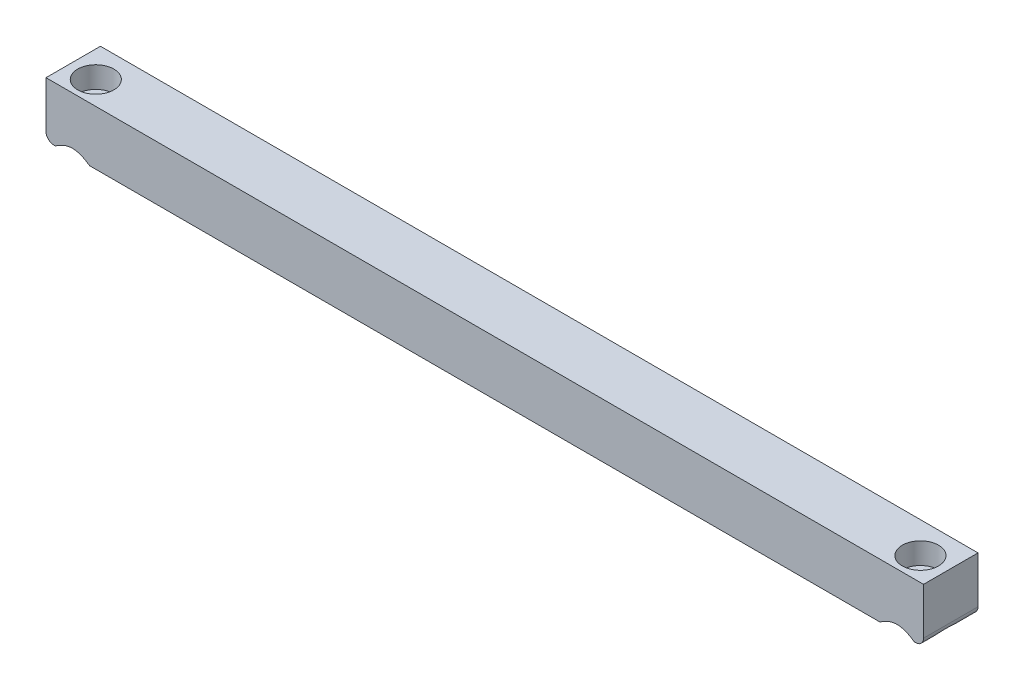
ISO-10303-21;
HEADER;
FILE_DESCRIPTION(('STEP AP214'),'2;1');
FILE_NAME('part.step','',(''),(''),'','','');
FILE_SCHEMA(('AUTOMOTIVE_DESIGN { 1 0 10303 214 1 1 1 1 }'));
ENDSEC;
DATA;
#1=APPLICATION_CONTEXT('core data for automotive mechanical design processes');
#2=APPLICATION_PROTOCOL_DEFINITION('international standard','automotive_design',2000,#1);
#3=PRODUCT_CONTEXT('',#1,'mechanical');
#4=PRODUCT('Part','Part','',(#3));
#5=PRODUCT_RELATED_PRODUCT_CATEGORY('part','',(#4));
#6=PRODUCT_DEFINITION_FORMATION('','',#4);
#7=PRODUCT_DEFINITION_CONTEXT('part definition',#1,'design');
#8=PRODUCT_DEFINITION('design','',#6,#7);
#9=PRODUCT_DEFINITION_SHAPE('','',#8);
#10=(LENGTH_UNIT() NAMED_UNIT(*) SI_UNIT(.MILLI.,.METRE.));
#11=(NAMED_UNIT(*) PLANE_ANGLE_UNIT() SI_UNIT($,.RADIAN.));
#12=(NAMED_UNIT(*) SI_UNIT($,.STERADIAN.) SOLID_ANGLE_UNIT());
#13=UNCERTAINTY_MEASURE_WITH_UNIT(LENGTH_MEASURE(1.E-05),#10,'distance_accuracy_value','');
#14=(GEOMETRIC_REPRESENTATION_CONTEXT(3) GLOBAL_UNCERTAINTY_ASSIGNED_CONTEXT((#13)) GLOBAL_UNIT_ASSIGNED_CONTEXT((#10,
#11,#12)) REPRESENTATION_CONTEXT('',''));
#15=CARTESIAN_POINT('',(0.,0.,0.));
#16=DIRECTION('',(0.,0.,1.));
#17=DIRECTION('',(1.,0.,0.));
#18=AXIS2_PLACEMENT_3D('',#15,#16,#17);
#19=CARTESIAN_POINT('',(109.4,0.,-3.));
#20=DIRECTION('',(0.,-1.,0.));
#21=DIRECTION('',(0.,0.,-1.));
#22=AXIS2_PLACEMENT_3D('',#19,#20,#21);
#23=CYLINDRICAL_SURFACE('',#22,1.47319999999999);
#24=CARTESIAN_POINT('',(109.4,2.59245827868183,-3.));
#25=DIRECTION('',(0.,-1.,0.));
#26=DIRECTION('',(0.,0.,-1.));
#27=AXIS2_PLACEMENT_3D('',#24,#25,#26);
#28=CIRCLE('',#27,1.47319999999999);
#29=CARTESIAN_POINT('',(109.4,2.59245827868183,-4.47319999999999));
#30=VERTEX_POINT('',#29);
#31=EDGE_CURVE('E156',#30,#30,#28,.T.);
#32=ORIENTED_EDGE('',*,*,#31,.T.);
#33=EDGE_LOOP('',(#32));
#34=FACE_BOUND('',#33,.T.);
#35=CARTESIAN_POINT('',(109.4,4.25,-3.));
#36=DIRECTION('',(0.,1.,0.));
#37=DIRECTION('',(0.,0.,1.));
#38=AXIS2_PLACEMENT_3D('',#35,#36,#37);
#39=CIRCLE('',#38,1.47319999999999);
#40=CARTESIAN_POINT('',(109.4,4.25,-1.52680000000001));
#41=VERTEX_POINT('',#40);
#42=EDGE_CURVE('E43',#41,#41,#39,.F.);
#43=ORIENTED_EDGE('',*,*,#42,.F.);
#44=EDGE_LOOP('',(#43));
#45=FACE_BOUND('',#44,.T.);
#46=ADVANCED_FACE('F38',(#34,#45),#23,.F.);
#47=CARTESIAN_POINT('',(3.4,0.,-3.));
#48=DIRECTION('',(0.,-1.,0.));
#49=DIRECTION('',(0.,0.,-1.));
#50=AXIS2_PLACEMENT_3D('',#47,#48,#49);
#51=CYLINDRICAL_SURFACE('',#50,1.4732);
#52=CARTESIAN_POINT('',(3.4,2.59245827868183,-3.));
#53=DIRECTION('',(0.,-1.,0.));
#54=DIRECTION('',(0.,0.,-1.));
#55=AXIS2_PLACEMENT_3D('',#52,#53,#54);
#56=CIRCLE('',#55,1.4732);
#57=CARTESIAN_POINT('',(3.4,2.59245827868183,-4.4732));
#58=VERTEX_POINT('',#57);
#59=EDGE_CURVE('E144',#58,#58,#56,.T.);
#60=ORIENTED_EDGE('',*,*,#59,.T.);
#61=EDGE_LOOP('',(#60));
#62=FACE_BOUND('',#61,.T.);
#63=CARTESIAN_POINT('',(3.4,4.25,-3.));
#64=DIRECTION('',(0.,1.,0.));
#65=DIRECTION('',(0.,0.,1.));
#66=AXIS2_PLACEMENT_3D('',#63,#64,#65);
#67=CIRCLE('',#66,1.4732);
#68=CARTESIAN_POINT('',(3.4,4.25,-1.5268));
#69=VERTEX_POINT('',#68);
#70=EDGE_CURVE('E149',#69,#69,#67,.F.);
#71=ORIENTED_EDGE('',*,*,#70,.F.);
#72=EDGE_LOOP('',(#71));
#73=FACE_BOUND('',#72,.T.);
#74=ADVANCED_FACE('F180',(#62,#73),#51,.F.);
#75=CARTESIAN_POINT('',(0.,0.,0.));
#76=DIRECTION('',(0.,-1.,0.));
#77=DIRECTION('',(0.,0.,-1.));
#78=AXIS2_PLACEMENT_3D('',#75,#76,#77);
#79=PLANE('',#78);
#80=DIRECTION('',(1.,0.,0.));
#81=VECTOR('',#80,1.);
#82=CARTESIAN_POINT('',(0.,0.,0.));
#83=LINE('',#82,#81);
#84=CARTESIAN_POINT('',(1.,0.,0.));
#85=VERTEX_POINT('',#84);
#86=CARTESIAN_POINT('',(1.18890056246487,0.,0.));
#87=VERTEX_POINT('',#86);
#88=EDGE_CURVE('E118',#85,#87,#83,.T.);
#89=ORIENTED_EDGE('',*,*,#88,.F.);
#90=DIRECTION('',(0.,0.,-1.));
#91=VECTOR('',#90,1.);
#92=CARTESIAN_POINT('',(1.,0.,-0.0744333825923676));
#93=LINE('',#92,#91);
#94=CARTESIAN_POINT('',(1.,0.,-0.148866765184735));
#95=VERTEX_POINT('',#94);
#96=EDGE_CURVE('E143',#85,#95,#93,.T.);
#97=ORIENTED_EDGE('',*,*,#96,.T.);
#98=CARTESIAN_POINT('',(3.4,0.,-3.));
#99=DIRECTION('',(0.,-1.,0.));
#100=DIRECTION('',(0.,0.,-1.));
#101=AXIS2_PLACEMENT_3D('',#98,#99,#100);
#102=CIRCLE('',#101,3.7267896);
#103=EDGE_CURVE('E135',#87,#95,#102,.T.);
#104=ORIENTED_EDGE('',*,*,#103,.F.);
#105=EDGE_LOOP('',(#89,#97,#104));
#106=FACE_BOUND('',#105,.T.);
#107=ADVANCED_FACE('F142',(#106),#79,.T.);
#108=CARTESIAN_POINT('',(109.4,0.,-3.));
#109=DIRECTION('',(0.,-1.,0.));
#110=DIRECTION('',(0.,0.,-1.));
#111=AXIS2_PLACEMENT_3D('',#108,#109,#110);
#112=CIRCLE('',#111,3.7267896);
#113=CARTESIAN_POINT('',(111.8,0.,-0.148866765184731));
#114=VERTEX_POINT('',#113);
#115=CARTESIAN_POINT('',(111.611099437535,0.,0.));
#116=VERTEX_POINT('',#115);
#117=EDGE_CURVE('E155',#114,#116,#112,.T.);
#118=ORIENTED_EDGE('',*,*,#117,.F.);
#119=DIRECTION('',(0.,0.,-1.));
#120=VECTOR('',#119,1.);
#121=CARTESIAN_POINT('',(111.8,0.,0.));
#122=LINE('',#121,#120);
#123=CARTESIAN_POINT('',(111.8,0.,0.));
#124=VERTEX_POINT('',#123);
#125=EDGE_CURVE('E11',#114,#124,#122,.F.);
#126=ORIENTED_EDGE('',*,*,#125,.T.);
#127=EDGE_CURVE('E131',#116,#124,#83,.T.);
#128=ORIENTED_EDGE('',*,*,#127,.F.);
#129=EDGE_LOOP('',(#118,#126,#128));
#130=FACE_BOUND('',#129,.T.);
#131=ADVANCED_FACE('F230',(#130),#79,.T.);
#132=CARTESIAN_POINT('',(0.,7.,0.));
#133=DIRECTION('',(1.,0.,0.));
#134=DIRECTION('',(0.,0.,-1.));
#135=AXIS2_PLACEMENT_3D('',#132,#133,#134);
#136=PLANE('',#135);
#137=DIRECTION('',(0.,-1.,0.));
#138=VECTOR('',#137,1.);
#139=CARTESIAN_POINT('',(0.,7.,-7.));
#140=LINE('',#139,#138);
#141=CARTESIAN_POINT('',(0.,7.,-7.));
#142=VERTEX_POINT('',#141);
#143=CARTESIAN_POINT('',(0.,1.,-7.));
#144=VERTEX_POINT('',#143);
#145=EDGE_CURVE('E239',#142,#144,#140,.T.);
#146=ORIENTED_EDGE('',*,*,#145,.T.);
#147=DIRECTION('',(0.,0.,1.));
#148=VECTOR('',#147,1.);
#149=CARTESIAN_POINT('',(0.,1.,-4.52609328766893));
#150=LINE('',#149,#148);
#151=CARTESIAN_POINT('',(0.,1.,0.));
#152=VERTEX_POINT('',#151);
#153=EDGE_CURVE('E139',#144,#152,#150,.T.);
#154=ORIENTED_EDGE('',*,*,#153,.T.);
#155=DIRECTION('',(0.,-1.,0.));
#156=VECTOR('',#155,1.);
#157=CARTESIAN_POINT('',(0.,7.,0.));
#158=LINE('',#157,#156);
#159=CARTESIAN_POINT('',(0.,7.,0.));
#160=VERTEX_POINT('',#159);
#161=EDGE_CURVE('E140',#160,#152,#158,.T.);
#162=ORIENTED_EDGE('',*,*,#161,.F.);
#163=DIRECTION('',(0.,0.,1.));
#164=VECTOR('',#163,1.);
#165=CARTESIAN_POINT('',(0.,7.,0.));
#166=LINE('',#165,#164);
#167=EDGE_CURVE('E168',#142,#160,#166,.T.);
#168=ORIENTED_EDGE('',*,*,#167,.F.);
#169=EDGE_LOOP('',(#146,#154,#162,#168));
#170=FACE_BOUND('',#169,.T.);
#171=ADVANCED_FACE('F274',(#170),#136,.F.);
#172=CARTESIAN_POINT('',(0.,7.,0.));
#173=DIRECTION('',(0.,0.,-1.));
#174=DIRECTION('',(-1.,0.,0.));
#175=AXIS2_PLACEMENT_3D('',#172,#173,#174);
#176=PLANE('',#175);
#177=ORIENTED_EDGE('',*,*,#161,.T.);
#178=CARTESIAN_POINT('',(1.,1.,0.));
#179=DIRECTION('',(0.,0.,-1.));
#180=DIRECTION('',(-1.,0.,0.));
#181=AXIS2_PLACEMENT_3D('',#178,#179,#180);
#182=CIRCLE('',#181,1.);
#183=EDGE_CURVE('E124',#152,#85,#182,.F.);
#184=ORIENTED_EDGE('',*,*,#183,.T.);
#185=ORIENTED_EDGE('',*,*,#88,.T.);
#186=CARTESIAN_POINT('',(-2.04068777861092,-2.86003146733069,0.));
#187=CARTESIAN_POINT('',(-1.91486649897334,-2.73330479596745,0.));
#188=CARTESIAN_POINT('',(-1.78855170996633,-2.60706286419875,0.));
#189=CARTESIAN_POINT('',(-1.53467062600414,-2.35580779330241,0.));
#190=CARTESIAN_POINT('',(-1.4071041529885,-2.23079483422062,0.));
#191=CARTESIAN_POINT('',(-1.14970407350928,-1.98153133379802,0.));
#192=CARTESIAN_POINT('',(-1.01986135862312,-1.85729017821418,0.));
#193=CARTESIAN_POINT('',(-0.758343842968389,-1.61076584767834,0.));
#194=CARTESIAN_POINT('',(-0.626669171395467,-1.48848253594776,0.));
#195=CARTESIAN_POINT('',(-0.351011636578417,-1.23727995201919,0.));
#196=CARTESIAN_POINT('',(-0.206849846252394,-1.10855633982085,0.));
#197=CARTESIAN_POINT('',(0.0848457089383862,-0.854992556540578,0.));
#198=CARTESIAN_POINT('',(0.232379167524994,-0.730152035136792,0.));
#199=CARTESIAN_POINT('',(0.531467467014695,-0.486138070093254,0.));
#200=CARTESIAN_POINT('',(0.683011278943903,-0.366951182427039,0.));
#201=CARTESIAN_POINT('',(0.991783172682102,-0.136233023724518,0.));
#202=CARTESIAN_POINT('',(1.1490080808976,-0.024697576348754,0.));
#203=CARTESIAN_POINT('',(1.41083744013197,0.147458470532663,0.));
#204=CARTESIAN_POINT('',(1.51315958217322,0.21153490963247,0.));
#205=CARTESIAN_POINT('',(1.72131542570844,0.333868056938868,0.));
#206=CARTESIAN_POINT('',(1.8271504064441,0.392122613364814,0.));
#207=CARTESIAN_POINT('',(2.04165059954081,0.500402836140528,0.));
#208=CARTESIAN_POINT('',(2.1502763376689,0.550505803200049,0.));
#209=CARTESIAN_POINT('',(2.37156069039562,0.640854303914732,0.));
#210=CARTESIAN_POINT('',(2.48421631226366,0.681106985422038,0.));
#211=CARTESIAN_POINT('',(2.67395497495853,0.737430746788554,0.));
#212=CARTESIAN_POINT('',(2.74998257329001,0.757060179930614,0.));
#213=CARTESIAN_POINT('',(2.90337132102818,0.790179918590291,0.));
#214=CARTESIAN_POINT('',(2.98073224887029,0.803671234086619,0.));
#215=CARTESIAN_POINT('',(3.13619236615175,0.823894969971055,0.));
#216=CARTESIAN_POINT('',(3.21428985612826,0.830640297079974,0.));
#217=CARTESIAN_POINT('',(3.3707801545543,0.837084282223051,0.));
#218=CARTESIAN_POINT('',(3.44917296526486,0.836782886196276,0.));
#219=CARTESIAN_POINT('',(3.60557290513233,0.829150363546847,0.));
#220=CARTESIAN_POINT('',(3.6835802012989,0.82182261000086,0.));
#221=CARTESIAN_POINT('',(3.83866862667551,0.80050199168716,0.));
#222=CARTESIAN_POINT('',(3.91574972159787,0.786508880944609,0.));
#223=CARTESIAN_POINT('',(4.06874873034158,0.752427518223542,0.));
#224=CARTESIAN_POINT('',(4.14466307756359,0.732323431663419,0.));
#225=CARTESIAN_POINT('',(4.29486234473077,0.68678006453453,0.));
#226=CARTESIAN_POINT('',(4.36914706336642,0.66134012887722,0.));
#227=CARTESIAN_POINT('',(4.57553058918519,0.583408687015946,0.));
#228=CARTESIAN_POINT('',(4.70566565579019,0.525709001786743,0.));
#229=CARTESIAN_POINT('',(4.96050096361983,0.399359549474757,0.));
#230=CARTESIAN_POINT('',(5.08519584379824,0.330699278340149,0.));
#231=CARTESIAN_POINT('',(5.33109179280967,0.184715416139402,0.));
#232=CARTESIAN_POINT('',(5.45224401426801,0.107310317579822,0.));
#233=CARTESIAN_POINT('',(5.63091168883304,-0.0132053481505687,0.));
#234=CARTESIAN_POINT('',(5.68994526821586,-0.054102760598346,0.));
#235=CARTESIAN_POINT('',(5.80710062280101,-0.137179431681928,0.));
#236=CARTESIAN_POINT('',(5.86522244055787,-0.179358630221579,0.));
#237=CARTESIAN_POINT('',(6.06936720042129,-0.330501041733518,0.));
#238=CARTESIAN_POINT('',(6.21317505454578,-0.442458800308884,0.));
#239=CARTESIAN_POINT('',(6.49675622291531,-0.671390916948923,0.));
#240=CARTESIAN_POINT('',(6.63652847003451,-0.788366581924544,0.));
#241=CARTESIAN_POINT('',(6.91301659959453,-1.02608272641852,0.));
#242=CARTESIAN_POINT('',(7.04972996450185,-1.14682612436052,0.));
#243=CARTESIAN_POINT('',(7.32066184490263,-1.39108676164083,0.));
#244=CARTESIAN_POINT('',(7.45488019829149,-1.51460418006808,0.));
#245=CARTESIAN_POINT('',(7.72180187615818,-1.76422814328495,0.));
#246=CARTESIAN_POINT('',(7.85449789001344,-1.89034248784701,0.));
#247=CARTESIAN_POINT('',(8.1182571565112,-2.14426918204297,0.));
#248=CARTESIAN_POINT('',(8.24932037387865,-2.27208156823864,0.));
#249=CARTESIAN_POINT('',(8.6403868657633,-2.65740964488783,0.));
#250=CARTESIAN_POINT('',(8.89840112330797,-2.91694307558273,0.));
#251=CARTESIAN_POINT('',(9.38253517149522,-3.4108152449966,0.));
#252=CARTESIAN_POINT('',(9.60903795528634,-3.64478065203675,0.));
#253=CARTESIAN_POINT('',(10.0598871104133,-4.11484237766952,0.));
#254=CARTESIAN_POINT('',(10.2842331718655,-4.35093899330259,0.));
#255=CARTESIAN_POINT('',(10.7296264543588,-4.82297873862795,0.));
#256=CARTESIAN_POINT('',(10.9506858012058,-5.05891044832355,0.));
#257=CARTESIAN_POINT('',(11.3914553985292,-5.5319533250451,0.));
#258=CARTESIAN_POINT('',(11.6111658807878,-5.76906427599745,0.));
#259=CARTESIAN_POINT('',(11.8303892830653,-6.00662142901221,0.));
#260=B_SPLINE_CURVE_WITH_KNOTS('',3,(#186,#187,#188,#189,#190,#191,#192,#193,#194,#195,#196,
#197,#198,#199,#200,#201,#202,#203,#204,#205,#206,#207,#208,#209,#210,#211,#212,#213,#214,#215,
#216,#217,#218,#219,#220,#221,#222,#223,#224,#225,#226,#227,#228,#229,#230,#231,#232,#233,#234,
#235,#236,#237,#238,#239,#240,#241,#242,#243,#244,#245,#246,#247,#248,#249,#250,#251,#252,#253,
#254,#255,#256,#257,#258,#259),.UNSPECIFIED.,.F.,.F.,(4,2,2,2,2,2,2,2,2,2,2,2,2,2,2,2,2,2,2,2,2,
2,2,2,2,2,2,2,2,2,2,2,2,2,2,2,4),(0.,0.535742754814112,1.07156286066978,1.61067093643198,
2.14974118331161,2.72949434677193,3.30919505387695,3.88744000267539,4.46536677809085,
4.82741275383952,5.18959205150453,5.54810658541805,5.9063601869102,6.14170689815212,
6.37701487093671,6.61187177595003,6.84673048273524,7.08147649955084,7.31623117998124,
7.55159941158319,7.786996556555,8.21327203870869,8.63995852094344,9.0710139581208,
9.28645026439798,9.50187648554516,10.0484458807097,10.5951585042974,11.1423056617079,
11.6894882447035,12.2386664302878,12.7878564598511,13.8856828340155,14.8625972954027,
15.8396500852786,16.8095826066398,17.7793435128104),.UNSPECIFIED.);
#261=CARTESIAN_POINT('',(5.61109943753513,0.,0.));
#262=VERTEX_POINT('',#261);
#263=EDGE_CURVE('E122',#87,#262,#260,.T.);
#264=ORIENTED_EDGE('',*,*,#263,.T.);
#265=CARTESIAN_POINT('',(107.188900562465,0.,0.));
#266=VERTEX_POINT('',#265);
#267=EDGE_CURVE('E129',#262,#266,#83,.T.);
#268=ORIENTED_EDGE('',*,*,#267,.T.);
#269=CARTESIAN_POINT('',(103.705130389263,-3.11743400278562,0.));
#270=CARTESIAN_POINT('',(103.834866190214,-2.98541242586914,0.));
#271=CARTESIAN_POINT('',(103.965073740249,-2.85384989499515,0.));
#272=CARTESIAN_POINT('',(104.22668312501,-2.59188727869565,0.));
#273=CARTESIAN_POINT('',(104.358085099307,-2.46148733274044,0.));
#274=CARTESIAN_POINT('',(104.622951443361,-2.20148960109288,0.));
#275=CARTESIAN_POINT('',(104.756422767396,-2.07189888629847,0.));
#276=CARTESIAN_POINT('',(105.025113451699,-1.81455435818634,0.));
#277=CARTESIAN_POINT('',(105.160332712809,-1.68680044152998,0.));
#278=CARTESIAN_POINT('',(105.441352187948,-1.42583009575077,0.));
#279=CARTESIAN_POINT('',(105.587290871372,-1.29276231710516,0.));
#280=CARTESIAN_POINT('',(105.882297679323,-1.03014574241715,0.));
#281=CARTESIAN_POINT('',(106.031365579675,-0.900596695809904,0.));
#282=CARTESIAN_POINT('',(106.333275270313,-0.646573728375905,0.));
#283=CARTESIAN_POINT('',(106.486108920771,-0.522090179898503,0.));
#284=CARTESIAN_POINT('',(106.79706806431,-0.279956176065771,0.));
#285=CARTESIAN_POINT('',(106.955191287666,-0.162302847710047,0.));
#286=CARTESIAN_POINT('',(107.220100546624,0.0222374398860309,0.));
#287=CARTESIAN_POINT('',(107.32479804914,0.0921104792451901,0.));
#288=CARTESIAN_POINT('',(107.537677643142,0.226476758667606,0.));
#289=CARTESIAN_POINT('',(107.645860970438,0.29096806102704,0.));
#290=CARTESIAN_POINT('',(107.865370700341,0.41231839492837,0.));
#291=CARTESIAN_POINT('',(107.9766661683,0.469232810411342,0.));
#292=CARTESIAN_POINT('',(108.203584468344,0.573678005608308,0.));
#293=CARTESIAN_POINT('',(108.319204245506,0.621215266266091,0.));
#294=CARTESIAN_POINT('',(108.512239678989,0.689085407664876,0.));
#295=CARTESIAN_POINT('',(108.588379933849,0.713044059886367,0.));
#296=CARTESIAN_POINT('',(108.742241575575,0.755143685885798,0.));
#297=CARTESIAN_POINT('',(108.819962311916,0.773287003702679,0.));
#298=CARTESIAN_POINT('',(108.976458399085,0.80297909947518,0.));
#299=CARTESIAN_POINT('',(109.055230469604,0.814544958133524,0.));
#300=CARTESIAN_POINT('',(109.213500316116,0.830602123889998,0.));
#301=CARTESIAN_POINT('',(109.292998067736,0.835093667725252,0.));
#302=CARTESIAN_POINT('',(109.45236562589,0.836771768911366,0.));
#303=CARTESIAN_POINT('',(109.532235722595,0.833931300730975,0.));
#304=CARTESIAN_POINT('',(109.691384301318,0.821038496703048,0.));
#305=CARTESIAN_POINT('',(109.770662770548,0.81098600541666,0.));
#306=CARTESIAN_POINT('',(109.928259471307,0.784131463980641,0.));
#307=CARTESIAN_POINT('',(110.006574779693,0.7673124692997,0.));
#308=CARTESIAN_POINT('',(110.161655235453,0.727650852604915,0.));
#309=CARTESIAN_POINT('',(110.238420120998,0.704807222181138,0.));
#310=CARTESIAN_POINT('',(110.436360484341,0.638425635537919,0.));
#311=CARTESIAN_POINT('',(110.55614950107,0.590751573459242,0.));
#312=CARTESIAN_POINT('',(110.791101713906,0.48514167503836,0.));
#313=CARTESIAN_POINT('',(110.906261199286,0.42719780064689,0.));
#314=CARTESIAN_POINT('',(111.13356396879,0.302995648029132,0.));
#315=CARTESIAN_POINT('',(111.245661895886,0.236655170034211,0.));
#316=CARTESIAN_POINT('',(111.410991110974,0.132779650740924,0.));
#317=CARTESIAN_POINT('',(111.465621866769,0.0974336172605208,0.));
#318=CARTESIAN_POINT('',(111.5740329594,0.025464214085633,0.));
#319=CARTESIAN_POINT('',(111.627813335162,-0.0111590968909532,0.));
#320=CARTESIAN_POINT('',(111.809585940385,-0.13772143053316,0.));
#321=CARTESIAN_POINT('',(111.935736550628,-0.230308860851537,0.));
#322=CARTESIAN_POINT('',(112.184482896106,-0.420160187777676,0.));
#323=CARTESIAN_POINT('',(112.307077653253,-0.517425351869592,0.));
#324=CARTESIAN_POINT('',(112.549499103698,-0.715541632934457,0.));
#325=CARTESIAN_POINT('',(112.6693233431,-0.81639574201673,0.));
#326=CARTESIAN_POINT('',(112.90665558883,-1.02080022245507,0.));
#327=CARTESIAN_POINT('',(113.024163421958,-1.12435079409602,0.));
#328=CARTESIAN_POINT('',(113.257761317871,-1.33398579258016,0.));
#329=CARTESIAN_POINT('',(113.373843616167,-1.44007885077537,0.));
#330=CARTESIAN_POINT('',(113.604436193134,-1.65396201783054,0.));
#331=CARTESIAN_POINT('',(113.718946429351,-1.76175217235218,0.));
#332=CARTESIAN_POINT('',(114.060408328761,-2.08704733517986,0.));
#333=CARTESIAN_POINT('',(114.285416954751,-2.3065912519256,0.));
#334=CARTESIAN_POINT('',(114.707373810576,-2.72517756543968,0.));
#335=CARTESIAN_POINT('',(114.904702012572,-2.92383934501029,0.));
#336=CARTESIAN_POINT('',(115.297165057688,-3.32337360484979,0.));
#337=CARTESIAN_POINT('',(115.492299573712,-3.52424640618925,0.));
#338=CARTESIAN_POINT('',(115.879216109001,-3.92594528196816,0.));
#339=CARTESIAN_POINT('',(116.071012521676,-4.12675752241048,0.));
#340=CARTESIAN_POINT('',(116.453211677786,-4.52963014583751,0.));
#341=CARTESIAN_POINT('',(116.643614686039,-4.7316902774499,0.));
#342=CARTESIAN_POINT('',(116.833505864438,-4.93422619840699,0.));
#343=B_SPLINE_CURVE_WITH_KNOTS('',3,(#269,#270,#271,#272,#273,#274,#275,#276,#277,#278,#279,
#280,#281,#282,#283,#284,#285,#286,#287,#288,#289,#290,#291,#292,#293,#294,#295,#296,#297,#298,
#299,#300,#301,#302,#303,#304,#305,#306,#307,#308,#309,#310,#311,#312,#313,#314,#315,#316,#317,
#318,#319,#320,#321,#322,#323,#324,#325,#326,#327,#328,#329,#330,#331,#332,#333,#334,#335,#336,
#337,#338,#339,#340,#341,#342),.UNSPECIFIED.,.F.,.F.,(4,2,2,2,2,2,2,2,2,2,2,2,2,2,2,2,2,2,2,2,2,
2,2,2,2,2,2,2,2,2,2,2,2,2,2,2,4),(0.,0.555296075733846,1.11065789500548,1.66874349884863,
2.22679758084293,2.81924795009357,3.41165602044101,4.002879847253,4.59385315791205,
4.97134896797717,5.34898011484625,5.72367850731621,6.09811701564738,6.33738815104747,
6.5765627196455,6.81511331683816,7.05365593092802,7.29307905897769,7.53250734740654,
7.77253897654797,8.01261080796531,8.39869970218151,8.78509212850169,9.175611834905,
9.3708029728038,9.56598514934137,10.0352598242157,10.5046623786996,10.9744658911685,
11.4443043992864,11.9160645715651,12.387837458678,13.33087371724,14.1708822993262,
15.011014515058,15.8440762738517,16.6769753666541),.UNSPECIFIED.);
#344=EDGE_CURVE('E159',#266,#116,#343,.T.);
#345=ORIENTED_EDGE('',*,*,#344,.T.);
#346=ORIENTED_EDGE('',*,*,#127,.T.);
#347=CARTESIAN_POINT('',(111.8,1.,0.));
#348=DIRECTION('',(0.,0.,-1.));
#349=DIRECTION('',(-1.,0.,0.));
#350=AXIS2_PLACEMENT_3D('',#347,#348,#349);
#351=CIRCLE('',#350,1.);
#352=CARTESIAN_POINT('',(112.8,1.,0.));
#353=VERTEX_POINT('',#352);
#354=EDGE_CURVE('E226',#124,#353,#351,.F.);
#355=ORIENTED_EDGE('',*,*,#354,.T.);
#356=DIRECTION('',(0.,-1.,0.));
#357=VECTOR('',#356,1.);
#358=CARTESIAN_POINT('',(112.8,7.,0.));
#359=LINE('',#358,#357);
#360=CARTESIAN_POINT('',(112.8,7.,0.));
#361=VERTEX_POINT('',#360);
#362=EDGE_CURVE('E245',#361,#353,#359,.T.);
#363=ORIENTED_EDGE('',*,*,#362,.F.);
#364=DIRECTION('',(1.,0.,0.));
#365=VECTOR('',#364,1.);
#366=CARTESIAN_POINT('',(0.,7.,0.));
#367=LINE('',#366,#365);
#368=EDGE_CURVE('E302',#160,#361,#367,.T.);
#369=ORIENTED_EDGE('',*,*,#368,.F.);
#370=EDGE_LOOP('',(#177,#184,#185,#264,#268,#345,#346,#355,#363,#369));
#371=FACE_BOUND('',#370,.T.);
#372=ADVANCED_FACE('F121',(#371),#176,.F.);
#373=CARTESIAN_POINT('',(112.8,7.,0.));
#374=DIRECTION('',(-1.,0.,0.));
#375=DIRECTION('',(0.,0.,1.));
#376=AXIS2_PLACEMENT_3D('',#373,#374,#375);
#377=PLANE('',#376);
#378=ORIENTED_EDGE('',*,*,#362,.T.);
#379=DIRECTION('',(0.,0.,-1.));
#380=VECTOR('',#379,1.);
#381=CARTESIAN_POINT('',(112.8,1.,-1.47390671233107));
#382=LINE('',#381,#380);
#383=CARTESIAN_POINT('',(112.8,1.,-7.));
#384=VERTEX_POINT('',#383);
#385=EDGE_CURVE('E190',#353,#384,#382,.T.);
#386=ORIENTED_EDGE('',*,*,#385,.T.);
#387=DIRECTION('',(0.,-1.,0.));
#388=VECTOR('',#387,1.);
#389=CARTESIAN_POINT('',(112.8,7.,-7.));
#390=LINE('',#389,#388);
#391=CARTESIAN_POINT('',(112.8,7.,-7.));
#392=VERTEX_POINT('',#391);
#393=EDGE_CURVE('E242',#392,#384,#390,.T.);
#394=ORIENTED_EDGE('',*,*,#393,.F.);
#395=DIRECTION('',(0.,0.,-1.));
#396=VECTOR('',#395,1.);
#397=CARTESIAN_POINT('',(112.8,7.,0.));
#398=LINE('',#397,#396);
#399=EDGE_CURVE('E301',#361,#392,#398,.T.);
#400=ORIENTED_EDGE('',*,*,#399,.F.);
#401=EDGE_LOOP('',(#378,#386,#394,#400));
#402=FACE_BOUND('',#401,.T.);
#403=ADVANCED_FACE('F281',(#402),#377,.F.);
#404=CARTESIAN_POINT('',(0.,7.,-7.));
#405=DIRECTION('',(0.,0.,1.));
#406=DIRECTION('',(1.,0.,0.));
#407=AXIS2_PLACEMENT_3D('',#404,#405,#406);
#408=PLANE('',#407);
#409=DIRECTION('',(-1.,0.,0.));
#410=VECTOR('',#409,1.);
#411=CARTESIAN_POINT('',(0.,0.,-7.));
#412=LINE('',#411,#410);
#413=CARTESIAN_POINT('',(111.8,0.,-7.));
#414=VERTEX_POINT('',#413);
#415=CARTESIAN_POINT('',(1.,0.,-7.));
#416=VERTEX_POINT('',#415);
#417=EDGE_CURVE('E128',#414,#416,#412,.T.);
#418=ORIENTED_EDGE('',*,*,#417,.T.);
#419=CARTESIAN_POINT('',(1.,1.,-7.));
#420=DIRECTION('',(0.,0.,1.));
#421=DIRECTION('',(1.,0.,0.));
#422=AXIS2_PLACEMENT_3D('',#419,#420,#421);
#423=CIRCLE('',#422,1.);
#424=EDGE_CURVE('E293',#416,#144,#423,.F.);
#425=ORIENTED_EDGE('',*,*,#424,.T.);
#426=ORIENTED_EDGE('',*,*,#145,.F.);
#427=DIRECTION('',(-1.,0.,0.));
#428=VECTOR('',#427,1.);
#429=CARTESIAN_POINT('',(0.,7.,-7.));
#430=LINE('',#429,#428);
#431=EDGE_CURVE('E235',#392,#142,#430,.T.);
#432=ORIENTED_EDGE('',*,*,#431,.F.);
#433=ORIENTED_EDGE('',*,*,#393,.T.);
#434=CARTESIAN_POINT('',(111.8,1.,-7.));
#435=DIRECTION('',(0.,0.,1.));
#436=DIRECTION('',(1.,0.,0.));
#437=AXIS2_PLACEMENT_3D('',#434,#435,#436);
#438=CIRCLE('',#437,1.);
#439=EDGE_CURVE('E63',#384,#414,#438,.F.);
#440=ORIENTED_EDGE('',*,*,#439,.T.);
#441=EDGE_LOOP('',(#418,#425,#426,#432,#433,#440));
#442=FACE_BOUND('',#441,.T.);
#443=ADVANCED_FACE('F296',(#442),#408,.F.);
#444=CARTESIAN_POINT('',(0.,7.,0.));
#445=DIRECTION('',(0.,-1.,0.));
#446=DIRECTION('',(0.,0.,-1.));
#447=AXIS2_PLACEMENT_3D('',#444,#445,#446);
#448=PLANE('',#447);
#449=CARTESIAN_POINT('',(109.4,7.,-3.));
#450=DIRECTION('',(0.,-1.,0.));
#451=DIRECTION('',(0.,0.,1.));
#452=AXIS2_PLACEMENT_3D('',#449,#450,#451);
#453=CIRCLE('',#452,2.325);
#454=CARTESIAN_POINT('',(109.4,7.,-0.674999999999999));
#455=VERTEX_POINT('',#454);
#456=EDGE_CURVE('E201',#455,#455,#453,.T.);
#457=ORIENTED_EDGE('',*,*,#456,.T.);
#458=EDGE_LOOP('',(#457));
#459=FACE_BOUND('',#458,.T.);
#460=CARTESIAN_POINT('',(3.4,7.,-3.));
#461=DIRECTION('',(0.,1.,0.));
#462=DIRECTION('',(0.,0.,1.));
#463=AXIS2_PLACEMENT_3D('',#460,#461,#462);
#464=CIRCLE('',#463,2.325);
#465=CARTESIAN_POINT('',(3.4,7.,-0.674999999999999));
#466=VERTEX_POINT('',#465);
#467=EDGE_CURVE('E151',#466,#466,#464,.T.);
#468=ORIENTED_EDGE('',*,*,#467,.F.);
#469=EDGE_LOOP('',(#468));
#470=FACE_BOUND('',#469,.T.);
#471=ORIENTED_EDGE('',*,*,#167,.T.);
#472=ORIENTED_EDGE('',*,*,#368,.T.);
#473=ORIENTED_EDGE('',*,*,#399,.T.);
#474=ORIENTED_EDGE('',*,*,#431,.T.);
#475=EDGE_LOOP('',(#471,#472,#473,#474));
#476=FACE_BOUND('',#475,.T.);
#477=ADVANCED_FACE('F304',(#459,#470,#476),#448,.F.);
#478=CARTESIAN_POINT('',(1.,0.,-5.85113323481526));
#479=VERTEX_POINT('',#478);
#480=EDGE_CURVE('E138',#479,#262,#102,.T.);
#481=ORIENTED_EDGE('',*,*,#480,.F.);
#482=DIRECTION('',(0.,0.,1.));
#483=VECTOR('',#482,1.);
#484=CARTESIAN_POINT('',(1.,0.,-7.));
#485=LINE('',#484,#483);
#486=EDGE_CURVE('E294',#479,#416,#485,.F.);
#487=ORIENTED_EDGE('',*,*,#486,.T.);
#488=ORIENTED_EDGE('',*,*,#417,.F.);
#489=DIRECTION('',(0.,0.,1.));
#490=VECTOR('',#489,1.);
#491=CARTESIAN_POINT('',(111.8,0.,-6.42556661740763));
#492=LINE('',#491,#490);
#493=CARTESIAN_POINT('',(111.8,0.,-5.85113323481527));
#494=VERTEX_POINT('',#493);
#495=EDGE_CURVE('E225',#414,#494,#492,.T.);
#496=ORIENTED_EDGE('',*,*,#495,.T.);
#497=EDGE_CURVE('E147',#266,#494,#112,.T.);
#498=ORIENTED_EDGE('',*,*,#497,.F.);
#499=ORIENTED_EDGE('',*,*,#267,.F.);
#500=EDGE_LOOP('',(#481,#487,#488,#496,#498,#499));
#501=FACE_BOUND('',#500,.T.);
#502=ADVANCED_FACE('F178',(#501),#79,.T.);
#503=CARTESIAN_POINT('',(109.4,0.,-3.));
#504=DIRECTION('',(0.,-1.,0.));
#505=DIRECTION('',(0.,0.,-1.));
#506=AXIS2_PLACEMENT_3D('',#503,#504,#505);
#507=CONICAL_SURFACE('',#506,3.7267896,0.715584993317677);
#508=ORIENTED_EDGE('',*,*,#31,.F.);
#509=EDGE_LOOP('',(#508));
#510=FACE_BOUND('',#509,.T.);
#511=ORIENTED_EDGE('',*,*,#497,.T.);
#512=CARTESIAN_POINT('',(111.8,0.,-5.85113323481527));
#513=CARTESIAN_POINT('',(111.833023452368,2.84245765048944E-05,-5.82330855476184));
#514=CARTESIAN_POINT('',(111.864599676885,0.00163461612707109,-5.79391738665574));
#515=CARTESIAN_POINT('',(111.924904405906,0.0073635972731605,-5.73275873657213));
#516=CARTESIAN_POINT('',(111.953642623037,0.0114774315850599,-5.70100006205481));
#517=CARTESIAN_POINT('',(112.008145253956,0.021517278903375,-5.63613836794097));
#518=CARTESIAN_POINT('',(112.033947290965,0.0274156563607178,-5.60306209978865));
#519=CARTESIAN_POINT('',(112.083286170822,0.0406243162226935,-5.53548507112979));
#520=CARTESIAN_POINT('',(112.106820435488,0.0479361778592696,-5.50098275156865));
#521=CARTESIAN_POINT('',(112.168043096478,0.0692841093177093,-5.40554024147311));
#522=CARTESIAN_POINT('',(112.20367126263,0.0843612807818118,-5.34351095231086));
#523=CARTESIAN_POINT('',(112.269572355129,0.116348419077187,-5.21715514929963));
#524=CARTESIAN_POINT('',(112.299843316061,0.133259054903472,-5.15282780271406));
#525=CARTESIAN_POINT('',(112.356034896484,0.168176459866621,-5.02173981149251));
#526=CARTESIAN_POINT('',(112.381905468815,0.18619302634639,-4.95496048847723));
#527=CARTESIAN_POINT('',(112.42948802382,0.222415819653697,-4.81997797154525));
#528=CARTESIAN_POINT('',(112.45119852655,0.240622111556389,-4.75177428044364));
#529=CARTESIAN_POINT('',(112.506663271511,0.290818294081414,-4.55977331396861));
#530=CARTESIAN_POINT('',(112.536363741744,0.322322023178474,-4.43466710807713));
#531=CARTESIAN_POINT('',(112.586146868986,0.380773418906276,-4.18146140910014));
#532=CARTESIAN_POINT('',(112.606222952376,0.407717963431579,-4.05335993264906));
#533=CARTESIAN_POINT('',(112.638281848744,0.454036044651345,-3.79549050568118));
#534=CARTESIAN_POINT('',(112.650307471151,0.473449393642174,-3.66573517019085));
#535=CARTESIAN_POINT('',(112.667608502051,0.502458471519277,-3.40473507917799));
#536=CARTESIAN_POINT('',(112.672887968085,0.512060101058811,-3.27349126688701));
#537=CARTESIAN_POINT('',(112.677290912453,0.520017467636231,-3.01224227762093));
#538=CARTESIAN_POINT('',(112.676492822295,0.518516492198725,-2.88224292612078));
#539=CARTESIAN_POINT('',(112.668828850547,0.50482990772334,-2.62295344987393));
#540=CARTESIAN_POINT('',(112.661960450123,0.49263986334643,-2.49366364195824));
#541=CARTESIAN_POINT('',(112.641387477496,0.45921614941115,-2.2365954000481));
#542=CARTESIAN_POINT('',(112.627670540095,0.437966132027111,-2.10882012934231));
#543=CARTESIAN_POINT('',(112.592152682213,0.388929980229005,-1.85574666502401));
#544=CARTESIAN_POINT('',(112.570354838318,0.36114633478585,-1.73044754778188));
#545=CARTESIAN_POINT('',(112.515115873606,0.299679866648356,-1.47395030215883));
#546=CARTESIAN_POINT('',(112.480955341993,0.265717662749206,-1.34296863838262));
#547=CARTESIAN_POINT('',(112.419292812783,0.214387675952622,-1.14991490680408));
#548=CARTESIAN_POINT('',(112.396995263576,0.197209181485605,-1.08611897556906));
#549=CARTESIAN_POINT('',(112.348471553887,0.163307433245868,-0.959934500107409));
#550=CARTESIAN_POINT('',(112.322246340695,0.146584070848765,-0.897545620685762));
#551=CARTESIAN_POINT('',(112.253367579031,0.107455970848664,-0.748644007098947));
#552=CARTESIAN_POINT('',(112.208437043396,0.0856102485182868,-0.662988399459003));
#553=CARTESIAN_POINT('',(112.132951315265,0.0566776005727525,-0.538822784947779));
#554=CARTESIAN_POINT('',(112.106513215818,0.0476895002999251,-0.498244949651229));
#555=CARTESIAN_POINT('',(112.050623199797,0.0314776040054052,-0.418864739848557));
#556=CARTESIAN_POINT('',(112.021173253507,0.0242526649067055,-0.38006122836165));
#557=CARTESIAN_POINT('',(111.961426235846,0.0126825398180949,-0.307790060040755));
#558=CARTESIAN_POINT('',(111.931385361568,0.0081532294915916,-0.274143869058527));
#559=CARTESIAN_POINT('',(111.868113833331,0.00182166721662312,-0.209365813711522));
#560=CARTESIAN_POINT('',(111.834866133127,3.49511360742216E-05,-0.17824921207009));
#561=CARTESIAN_POINT('',(111.8,0.,-0.14886676518473));
#562=B_SPLINE_CURVE_WITH_KNOTS('',3,(#512,#513,#514,#515,#516,#517,#518,#519,#520,#521,#522,
#523,#524,#525,#526,#527,#528,#529,#530,#531,#532,#533,#534,#535,#536,#537,#538,#539,#540,#541,
#542,#543,#544,#545,#546,#547,#548,#549,#550,#551,#552,#553,#554,#555,#556,#557,#558,#559,#560,
#561),.UNSPECIFIED.,.F.,.F.,(4,2,2,2,2,2,2,2,2,2,2,2,2,2,2,2,2,2,2,2,2,2,2,2,4),(0.,
0.129328828864925,0.258198483164794,0.385166583773875,0.512277369534898,0.731235666305675,
0.95027412724381,1.17165773638408,1.39311995706833,1.78972424135811,2.18659902854311,
2.58134625074962,2.97585593663664,3.36528314383182,3.75487201706934,4.14516686001848,
4.53531326119551,4.9532797810518,5.1623606004621,5.37139107390675,5.66809407344911,
5.81574757012819,5.96330508557128,6.09905939519674,6.23557990558803),.UNSPECIFIED.);
#563=EDGE_CURVE('E48',#494,#114,#562,.T.);
#564=ORIENTED_EDGE('',*,*,#563,.T.);
#565=ORIENTED_EDGE('',*,*,#117,.T.);
#566=ORIENTED_EDGE('',*,*,#344,.F.);
#567=EDGE_LOOP('',(#511,#564,#565,#566));
#568=FACE_BOUND('',#567,.T.);
#569=ADVANCED_FACE('F173',(#510,#568),#507,.F.);
#570=CARTESIAN_POINT('',(3.4,0.,-3.));
#571=DIRECTION('',(0.,-1.,0.));
#572=DIRECTION('',(0.,0.,-1.));
#573=AXIS2_PLACEMENT_3D('',#570,#571,#572);
#574=CONICAL_SURFACE('',#573,3.7267896,0.715584993317675);
#575=ORIENTED_EDGE('',*,*,#59,.F.);
#576=EDGE_LOOP('',(#575));
#577=FACE_BOUND('',#576,.T.);
#578=ORIENTED_EDGE('',*,*,#103,.T.);
#579=CARTESIAN_POINT('',(1.,0.,-0.148866765184735));
#580=CARTESIAN_POINT('',(0.966976547632013,2.84245765053522E-05,-0.176691445238171));
#581=CARTESIAN_POINT('',(0.935400323115373,0.00163461612707146,-0.206082613344264));
#582=CARTESIAN_POINT('',(0.875095594094422,0.00736359727316069,-0.267241263427877));
#583=CARTESIAN_POINT('',(0.846357376962641,0.0114774315850602,-0.298999937945201));
#584=CARTESIAN_POINT('',(0.79185474604415,0.0215172789033757,-0.363861632059042));
#585=CARTESIAN_POINT('',(0.766052709035417,0.0274156563607182,-0.396937900211362));
#586=CARTESIAN_POINT('',(0.716713829178477,0.0406243162226935,-0.464514928870218));
#587=CARTESIAN_POINT('',(0.693179564512275,0.0479361778592693,-0.499017248431358));
#588=CARTESIAN_POINT('',(0.631956903522113,0.0692841093177088,-0.594459758526893));
#589=CARTESIAN_POINT('',(0.596328737370089,0.0843612807818114,-0.656489047689139));
#590=CARTESIAN_POINT('',(0.53042764487078,0.116348419077187,-0.78284485070038));
#591=CARTESIAN_POINT('',(0.500156683938879,0.133259054903473,-0.84717219728595));
#592=CARTESIAN_POINT('',(0.443965103515859,0.168176459866621,-0.978260188507501));
#593=CARTESIAN_POINT('',(0.418094531184504,0.18619302634639,-1.04503951152278));
#594=CARTESIAN_POINT('',(0.370511976179563,0.222415819653698,-1.18002202845475));
#595=CARTESIAN_POINT('',(0.348801473449838,0.24062211155639,-1.24822571955637));
#596=CARTESIAN_POINT('',(0.293336728489109,0.290818294081416,-1.4402266860314));
#597=CARTESIAN_POINT('',(0.263636258256152,0.322322023178476,-1.56533289192289));
#598=CARTESIAN_POINT('',(0.213853131013723,0.380773418906277,-1.81853859089987));
#599=CARTESIAN_POINT('',(0.193777047624449,0.40771796343158,-1.94664006735095));
#600=CARTESIAN_POINT('',(0.161718151255598,0.454036044651344,-2.20450949431882));
#601=CARTESIAN_POINT('',(0.149692528849444,0.473449393642173,-2.33426482980916));
#602=CARTESIAN_POINT('',(0.132391497948511,0.502458471519276,-2.59526492082202));
#603=CARTESIAN_POINT('',(0.127112031915169,0.51206010105881,-2.72650873311299));
#604=CARTESIAN_POINT('',(0.122709087546615,0.52001746763623,-2.98775772237907));
#605=CARTESIAN_POINT('',(0.123507177704956,0.518516492198723,-3.11775707387922));
#606=CARTESIAN_POINT('',(0.131171149453479,0.504829907723338,-3.37704655012608));
#607=CARTESIAN_POINT('',(0.138039549877082,0.492639863346429,-3.50633635804176));
#608=CARTESIAN_POINT('',(0.158612522503928,0.459216149411149,-3.76340459995191));
#609=CARTESIAN_POINT('',(0.172329459905316,0.43796613202711,-3.89117987065769));
#610=CARTESIAN_POINT('',(0.207847317786733,0.388929980229003,-4.14425333497599));
#611=CARTESIAN_POINT('',(0.229645161681928,0.361146334785849,-4.26955245221812));
#612=CARTESIAN_POINT('',(0.284884126393769,0.299679866648355,-4.52604969784116));
#613=CARTESIAN_POINT('',(0.31904465800698,0.265717662749206,-4.65703136161738));
#614=CARTESIAN_POINT('',(0.380707187216543,0.214387675952621,-4.85008509319591));
#615=CARTESIAN_POINT('',(0.403004736424256,0.197209181485604,-4.91388102443094));
#616=CARTESIAN_POINT('',(0.451528446113384,0.163307433245867,-5.04006549989259));
#617=CARTESIAN_POINT('',(0.477753659305396,0.146584070848765,-5.10245437931423));
#618=CARTESIAN_POINT('',(0.546632420969102,0.107455970848665,-5.25135599290104));
#619=CARTESIAN_POINT('',(0.591562956603717,0.0856102485182882,-5.33701160054099));
#620=CARTESIAN_POINT('',(0.667048684735242,0.0566776005727535,-5.46117721505221));
#621=CARTESIAN_POINT('',(0.693486784182028,0.0476895002999257,-5.50175505034876));
#622=CARTESIAN_POINT('',(0.749376800203224,0.0314776040054055,-5.58113526015144));
#623=CARTESIAN_POINT('',(0.778826746492977,0.0242526649067058,-5.61993877163834));
#624=CARTESIAN_POINT('',(0.838573764154243,0.0126825398180949,-5.69220993995924));
#625=CARTESIAN_POINT('',(0.868614638431626,0.00815322949159141,-5.72585613094147));
#626=CARTESIAN_POINT('',(0.931886166668817,0.0018216672166229,-5.79063418628848));
#627=CARTESIAN_POINT('',(0.965133866873319,3.49511360740826E-05,-5.82175078792991));
#628=CARTESIAN_POINT('',(1.,0.,-5.85113323481526));
#629=B_SPLINE_CURVE_WITH_KNOTS('',3,(#579,#580,#581,#582,#583,#584,#585,#586,#587,#588,#589,
#590,#591,#592,#593,#594,#595,#596,#597,#598,#599,#600,#601,#602,#603,#604,#605,#606,#607,#608,
#609,#610,#611,#612,#613,#614,#615,#616,#617,#618,#619,#620,#621,#622,#623,#624,#625,#626,#627,
#628),.UNSPECIFIED.,.F.,.F.,(4,2,2,2,2,2,2,2,2,2,2,2,2,2,2,2,2,2,2,2,2,2,2,2,4),(0.,
0.129328828864922,0.258198483164803,0.385166583773875,0.5122773695349,0.731235666305677,
0.950274127243811,1.17165773638409,1.39311995706833,1.78972424135812,2.18659902854312,
2.58134625074962,2.97585593663664,3.36528314383182,3.75487201706934,4.14516686001848,
4.5353132611955,4.95327978105179,5.1623606004621,5.37139107390674,5.66809407344909,
5.81574757012818,5.96330508557126,6.09905939519673,6.23557990558802),.UNSPECIFIED.);
#630=EDGE_CURVE('E262',#95,#479,#629,.T.);
#631=ORIENTED_EDGE('',*,*,#630,.T.);
#632=ORIENTED_EDGE('',*,*,#480,.T.);
#633=ORIENTED_EDGE('',*,*,#263,.F.);
#634=EDGE_LOOP('',(#578,#631,#632,#633));
#635=FACE_BOUND('',#634,.T.);
#636=ADVANCED_FACE('F134',(#577,#635),#574,.F.);
#637=CARTESIAN_POINT('',(1.,1.,0.));
#638=DIRECTION('',(0.,0.,-1.));
#639=DIRECTION('',(-1.,0.,0.));
#640=AXIS2_PLACEMENT_3D('',#637,#638,#639);
#641=CYLINDRICAL_SURFACE('',#640,1.);
#642=ORIENTED_EDGE('',*,*,#424,.F.);
#643=ORIENTED_EDGE('',*,*,#486,.F.);
#644=ORIENTED_EDGE('',*,*,#630,.F.);
#645=ORIENTED_EDGE('',*,*,#96,.F.);
#646=ORIENTED_EDGE('',*,*,#183,.F.);
#647=ORIENTED_EDGE('',*,*,#153,.F.);
#648=EDGE_LOOP('',(#642,#643,#644,#645,#646,#647));
#649=FACE_BOUND('',#648,.T.);
#650=ADVANCED_FACE('F256',(#649),#641,.T.);
#651=CARTESIAN_POINT('',(111.8,1.,0.));
#652=DIRECTION('',(0.,0.,1.));
#653=DIRECTION('',(1.,0.,0.));
#654=AXIS2_PLACEMENT_3D('',#651,#652,#653);
#655=CYLINDRICAL_SURFACE('',#654,1.);
#656=ORIENTED_EDGE('',*,*,#354,.F.);
#657=ORIENTED_EDGE('',*,*,#125,.F.);
#658=ORIENTED_EDGE('',*,*,#563,.F.);
#659=ORIENTED_EDGE('',*,*,#495,.F.);
#660=ORIENTED_EDGE('',*,*,#439,.F.);
#661=ORIENTED_EDGE('',*,*,#385,.F.);
#662=EDGE_LOOP('',(#656,#657,#658,#659,#660,#661));
#663=FACE_BOUND('',#662,.T.);
#664=ADVANCED_FACE('F40',(#663),#655,.T.);
#665=CARTESIAN_POINT('',(3.4,4.25,-3.));
#666=DIRECTION('',(0.,1.,0.));
#667=DIRECTION('',(0.,0.,1.));
#668=AXIS2_PLACEMENT_3D('',#665,#666,#667);
#669=PLANE('',#668);
#670=CARTESIAN_POINT('',(3.4,4.25,-3.));
#671=DIRECTION('',(0.,1.,0.));
#672=DIRECTION('',(0.,0.,1.));
#673=AXIS2_PLACEMENT_3D('',#670,#671,#672);
#674=CIRCLE('',#673,2.325);
#675=CARTESIAN_POINT('',(3.4,4.25,-0.674999999999999));
#676=VERTEX_POINT('',#675);
#677=EDGE_CURVE('E193',#676,#676,#674,.T.);
#678=ORIENTED_EDGE('',*,*,#677,.T.);
#679=EDGE_LOOP('',(#678));
#680=FACE_BOUND('',#679,.T.);
#681=ORIENTED_EDGE('',*,*,#70,.T.);
#682=EDGE_LOOP('',(#681));
#683=FACE_BOUND('',#682,.T.);
#684=ADVANCED_FACE('F358',(#680,#683),#669,.T.);
#685=CARTESIAN_POINT('',(3.4,4.25,-3.));
#686=DIRECTION('',(0.,1.,0.));
#687=DIRECTION('',(0.,0.,1.));
#688=AXIS2_PLACEMENT_3D('',#685,#686,#687);
#689=CYLINDRICAL_SURFACE('',#688,2.325);
#690=ORIENTED_EDGE('',*,*,#677,.F.);
#691=EDGE_LOOP('',(#690));
#692=FACE_BOUND('',#691,.T.);
#693=ORIENTED_EDGE('',*,*,#467,.T.);
#694=EDGE_LOOP('',(#693));
#695=FACE_BOUND('',#694,.T.);
#696=ADVANCED_FACE('F258',(#692,#695),#689,.F.);
#697=CARTESIAN_POINT('',(109.4,4.25,-3.));
#698=DIRECTION('',(0.,1.,0.));
#699=DIRECTION('',(0.,0.,1.));
#700=AXIS2_PLACEMENT_3D('',#697,#698,#699);
#701=PLANE('',#700);
#702=CARTESIAN_POINT('',(109.4,4.25,-3.));
#703=DIRECTION('',(0.,-1.,0.));
#704=DIRECTION('',(0.,0.,1.));
#705=AXIS2_PLACEMENT_3D('',#702,#703,#704);
#706=CIRCLE('',#705,2.325);
#707=CARTESIAN_POINT('',(109.4,4.25,-0.674999999999999));
#708=VERTEX_POINT('',#707);
#709=EDGE_CURVE('E204',#708,#708,#706,.T.);
#710=ORIENTED_EDGE('',*,*,#709,.F.);
#711=EDGE_LOOP('',(#710));
#712=FACE_BOUND('',#711,.T.);
#713=ORIENTED_EDGE('',*,*,#42,.T.);
#714=EDGE_LOOP('',(#713));
#715=FACE_BOUND('',#714,.T.);
#716=ADVANCED_FACE('F211',(#712,#715),#701,.T.);
#717=CARTESIAN_POINT('',(109.4,4.25,-3.));
#718=DIRECTION('',(0.,1.,0.));
#719=DIRECTION('',(0.,0.,1.));
#720=AXIS2_PLACEMENT_3D('',#717,#718,#719);
#721=CYLINDRICAL_SURFACE('',#720,2.325);
#722=ORIENTED_EDGE('',*,*,#709,.T.);
#723=EDGE_LOOP('',(#722));
#724=FACE_BOUND('',#723,.T.);
#725=ORIENTED_EDGE('',*,*,#456,.F.);
#726=EDGE_LOOP('',(#725));
#727=FACE_BOUND('',#726,.T.);
#728=ADVANCED_FACE('F395',(#724,#727),#721,.F.);
#729=CLOSED_SHELL('',(#46,#74,#107,#131,#171,#372,#403,#443,#477,#502,#569,#636,#650,#664,#684,
#696,#716,#728));
#730=MANIFOLD_SOLID_BREP('B2',#729);
#731=ADVANCED_BREP_SHAPE_REPRESENTATION('',(#18,#730),#14);
#732=SHAPE_DEFINITION_REPRESENTATION(#9,#731);
ENDSEC;
END-ISO-10303-21;
